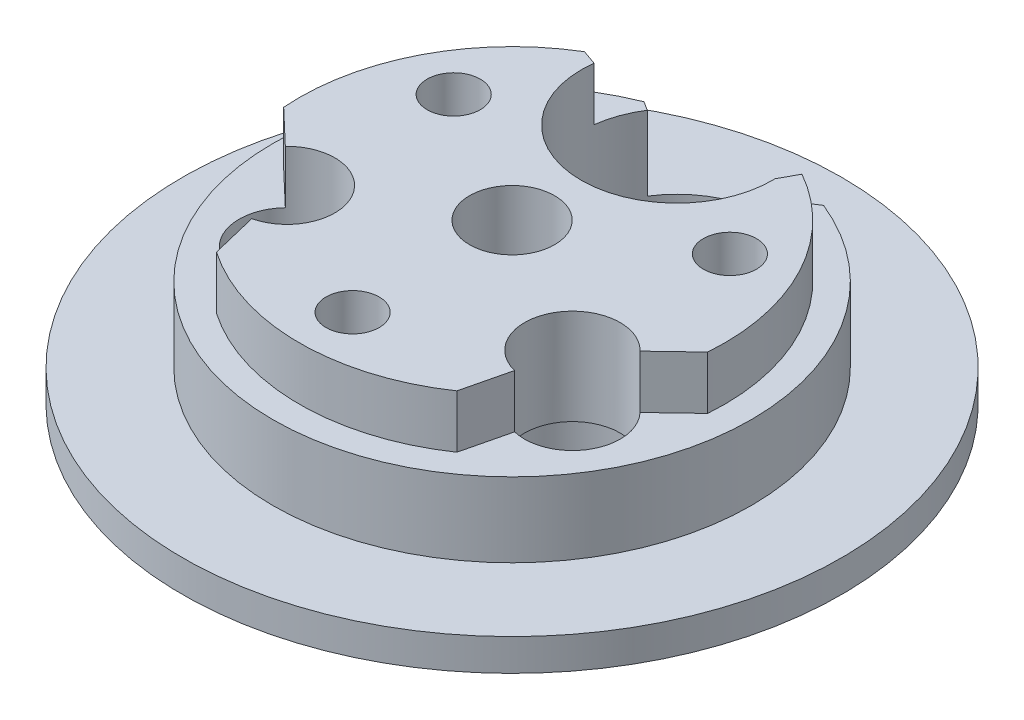
ISO-10303-21;
HEADER;
FILE_DESCRIPTION(('STEP AP214'),'2;1');
FILE_NAME('part.step','',(''),(''),'','','');
FILE_SCHEMA(('AUTOMOTIVE_DESIGN { 1 0 10303 214 1 1 1 1 }'));
ENDSEC;
DATA;
#1=APPLICATION_CONTEXT('core data for automotive mechanical design processes');
#2=APPLICATION_PROTOCOL_DEFINITION('international standard','automotive_design',2000,#1);
#3=PRODUCT_CONTEXT('',#1,'mechanical');
#4=PRODUCT('Part','Part','',(#3));
#5=PRODUCT_RELATED_PRODUCT_CATEGORY('part','',(#4));
#6=PRODUCT_DEFINITION_FORMATION('','',#4);
#7=PRODUCT_DEFINITION_CONTEXT('part definition',#1,'design');
#8=PRODUCT_DEFINITION('design','',#6,#7);
#9=PRODUCT_DEFINITION_SHAPE('','',#8);
#10=(LENGTH_UNIT() NAMED_UNIT(*) SI_UNIT(.MILLI.,.METRE.));
#11=(NAMED_UNIT(*) PLANE_ANGLE_UNIT() SI_UNIT($,.RADIAN.));
#12=(NAMED_UNIT(*) SI_UNIT($,.STERADIAN.) SOLID_ANGLE_UNIT());
#13=UNCERTAINTY_MEASURE_WITH_UNIT(LENGTH_MEASURE(1.E-05),#10,'distance_accuracy_value','');
#14=(GEOMETRIC_REPRESENTATION_CONTEXT(3) GLOBAL_UNCERTAINTY_ASSIGNED_CONTEXT((#13)) GLOBAL_UNIT_ASSIGNED_CONTEXT((#10,
#11,#12)) REPRESENTATION_CONTEXT('',''));
#15=CARTESIAN_POINT('',(0.,0.,0.));
#16=DIRECTION('',(0.,0.,1.));
#17=DIRECTION('',(1.,0.,0.));
#18=AXIS2_PLACEMENT_3D('',#15,#16,#17);
#19=CARTESIAN_POINT('',(13.4233937586587,0.,7.74999999999898));
#20=DIRECTION('',(0.,1.,0.));
#21=DIRECTION('',(0.,0.,1.));
#22=AXIS2_PLACEMENT_3D('',#19,#20,#21);
#23=CYLINDRICAL_SURFACE('',#22,4.5);
#24=CARTESIAN_POINT('',(13.4233937586596,7.,7.74999999999932));
#25=DIRECTION('',(0.,-1.,0.));
#26=DIRECTION('',(0.,0.,-1.));
#27=AXIS2_PLACEMENT_3D('',#24,#25,#26);
#28=CIRCLE('',#27,4.49999999999907);
#29=CARTESIAN_POINT('',(16.6818973601522,7.,4.64642878621094));
#30=VERTEX_POINT('',#29);
#31=CARTESIAN_POINT('',(12.3648740458117,7.,12.1237325041097));
#32=VERTEX_POINT('',#31);
#33=EDGE_CURVE('E210',#30,#32,#28,.T.);
#34=ORIENTED_EDGE('',*,*,#33,.F.);
#35=DIRECTION('',(0.,1.,0.));
#36=VECTOR('',#35,1.);
#37=CARTESIAN_POINT('',(16.6818973601522,0.,4.64642878621094));
#38=LINE('',#37,#36);
#39=CARTESIAN_POINT('',(16.6818973601522,12.,4.64642878621094));
#40=VERTEX_POINT('',#39);
#41=EDGE_CURVE('E254',#30,#40,#38,.T.);
#42=ORIENTED_EDGE('',*,*,#41,.T.);
#43=CARTESIAN_POINT('',(13.4233937586587,12.,7.74999999999898));
#44=DIRECTION('',(0.,1.,0.));
#45=DIRECTION('',(0.,0.,1.));
#46=AXIS2_PLACEMENT_3D('',#43,#44,#45);
#47=CIRCLE('',#46,4.5);
#48=CARTESIAN_POINT('',(12.3648740458117,12.,12.1237325041097));
#49=VERTEX_POINT('',#48);
#50=EDGE_CURVE('E250',#40,#49,#47,.T.);
#51=ORIENTED_EDGE('',*,*,#50,.T.);
#52=DIRECTION('',(0.,1.,0.));
#53=VECTOR('',#52,1.);
#54=CARTESIAN_POINT('',(12.3648740458117,0.,12.1237325041097));
#55=LINE('',#54,#53);
#56=EDGE_CURVE('E257',#32,#49,#55,.T.);
#57=ORIENTED_EDGE('',*,*,#56,.F.);
#58=EDGE_LOOP('',(#34,#42,#51,#57));
#59=FACE_BOUND('',#58,.T.);
#60=CARTESIAN_POINT('',(13.4233937586587,3.,7.74999999999898));
#61=DIRECTION('',(0.,-1.,0.));
#62=DIRECTION('',(0.,0.,-1.));
#63=AXIS2_PLACEMENT_3D('',#60,#61,#62);
#64=CIRCLE('',#63,4.5);
#65=CARTESIAN_POINT('',(13.4233937586587,3.,3.24999999999898));
#66=VERTEX_POINT('',#65);
#67=EDGE_CURVE('E194',#66,#66,#64,.T.);
#68=ORIENTED_EDGE('',*,*,#67,.T.);
#69=EDGE_LOOP('',(#68));
#70=FACE_BOUND('',#69,.T.);
#71=ADVANCED_FACE('F37',(#59,#70),#23,.F.);
#72=CARTESIAN_POINT('',(-13.4233937586578,0.,7.75000000000058));
#73=DIRECTION('',(0.,1.,0.));
#74=DIRECTION('',(0.,0.,1.));
#75=AXIS2_PLACEMENT_3D('',#72,#73,#74);
#76=CYLINDRICAL_SURFACE('',#75,4.5);
#77=CARTESIAN_POINT('',(-13.4233937586582,7.,7.75000000000077));
#78=DIRECTION('',(0.,-1.,0.));
#79=DIRECTION('',(0.,0.,-1.));
#80=AXIS2_PLACEMENT_3D('',#77,#78,#79);
#81=CIRCLE('',#80,4.49999999999986);
#82=CARTESIAN_POINT('',(-12.3648740458096,7.,12.123732504111));
#83=VERTEX_POINT('',#82);
#84=CARTESIAN_POINT('',(-16.6818973601514,7.,4.64642878621265));
#85=VERTEX_POINT('',#84);
#86=EDGE_CURVE('E217',#83,#85,#81,.T.);
#87=ORIENTED_EDGE('',*,*,#86,.F.);
#88=DIRECTION('',(0.,1.,0.));
#89=VECTOR('',#88,1.);
#90=CARTESIAN_POINT('',(-12.3648740458096,0.,12.123732504111));
#91=LINE('',#90,#89);
#92=CARTESIAN_POINT('',(-12.3648740458096,12.,12.123732504111));
#93=VERTEX_POINT('',#92);
#94=EDGE_CURVE('E263',#83,#93,#91,.T.);
#95=ORIENTED_EDGE('',*,*,#94,.T.);
#96=CARTESIAN_POINT('',(-13.4233937586578,12.,7.75000000000058));
#97=DIRECTION('',(0.,1.,0.));
#98=DIRECTION('',(0.,0.,1.));
#99=AXIS2_PLACEMENT_3D('',#96,#97,#98);
#100=CIRCLE('',#99,4.5);
#101=CARTESIAN_POINT('',(-16.6818973601514,12.,4.64642878621265));
#102=VERTEX_POINT('',#101);
#103=EDGE_CURVE('E238',#93,#102,#100,.T.);
#104=ORIENTED_EDGE('',*,*,#103,.T.);
#105=DIRECTION('',(0.,1.,0.));
#106=VECTOR('',#105,1.);
#107=CARTESIAN_POINT('',(-16.6818973601514,0.,4.64642878621265));
#108=LINE('',#107,#106);
#109=EDGE_CURVE('E265',#85,#102,#108,.T.);
#110=ORIENTED_EDGE('',*,*,#109,.F.);
#111=EDGE_LOOP('',(#87,#95,#104,#110));
#112=FACE_BOUND('',#111,.T.);
#113=CARTESIAN_POINT('',(-13.4233937586578,3.,7.75000000000058));
#114=DIRECTION('',(0.,-1.,0.));
#115=DIRECTION('',(0.,0.,-1.));
#116=AXIS2_PLACEMENT_3D('',#113,#114,#115);
#117=CIRCLE('',#116,4.5);
#118=CARTESIAN_POINT('',(-13.4233937586578,3.,3.25000000000058));
#119=VERTEX_POINT('',#118);
#120=EDGE_CURVE('E186',#119,#119,#117,.T.);
#121=ORIENTED_EDGE('',*,*,#120,.T.);
#122=EDGE_LOOP('',(#121));
#123=FACE_BOUND('',#122,.T.);
#124=ADVANCED_FACE('F347',(#112,#123),#76,.F.);
#125=CARTESIAN_POINT('',(10.2554041460994,0.,10.7673609022921));
#126=DIRECTION('',(0.689682491953068,0.,0.724111911442842));
#127=DIRECTION('',(0.724111911442842,0.,-0.689682491953068));
#128=AXIS2_PLACEMENT_3D('',#125,#126,#127);
#129=PLANE('',#128);
#130=ORIENTED_EDGE('',*,*,#41,.F.);
#131=DIRECTION('',(0.724111911442842,0.,-0.689682491953068));
#132=VECTOR('',#131,1.);
#133=CARTESIAN_POINT('',(10.2554041460994,7.,10.7673609022921));
#134=LINE('',#133,#132);
#135=CARTESIAN_POINT('',(19.940400961646,7.,1.54285757242123));
#136=VERTEX_POINT('',#135);
#137=EDGE_CURVE('E215',#30,#136,#134,.T.);
#138=ORIENTED_EDGE('',*,*,#137,.T.);
#139=DIRECTION('',(0.,1.,0.));
#140=VECTOR('',#139,1.);
#141=CARTESIAN_POINT('',(19.940400961646,0.,1.54285757242123));
#142=LINE('',#141,#140);
#143=CARTESIAN_POINT('',(19.940400961646,12.,1.54285757242123));
#144=VERTEX_POINT('',#143);
#145=EDGE_CURVE('E253',#136,#144,#142,.T.);
#146=ORIENTED_EDGE('',*,*,#145,.T.);
#147=DIRECTION('',(0.724111911442842,0.,-0.689682491953068));
#148=VECTOR('',#147,1.);
#149=CARTESIAN_POINT('',(10.2554041460994,12.,10.7673609022921));
#150=LINE('',#149,#148);
#151=EDGE_CURVE('E224',#40,#144,#150,.T.);
#152=ORIENTED_EDGE('',*,*,#151,.F.);
#153=EDGE_LOOP('',(#130,#138,#146,#152));
#154=FACE_BOUND('',#153,.T.);
#155=ADVANCED_FACE('F368',(#154),#129,.T.);
#156=CARTESIAN_POINT('',(14.4525101461505,0.,3.49776006544996));
#157=DIRECTION('',(0.97194055646898,0.,0.23522660285514));
#158=DIRECTION('',(0.23522660285514,0.,-0.97194055646898));
#159=AXIS2_PLACEMENT_3D('',#156,#157,#158);
#160=PLANE('',#159);
#161=DIRECTION('',(0.,1.,0.));
#162=VECTOR('',#161,1.);
#163=CARTESIAN_POINT('',(11.3063543329633,0.,16.4974650082211));
#164=LINE('',#163,#162);
#165=CARTESIAN_POINT('',(11.3063543329633,7.,16.4974650082211));
#166=VERTEX_POINT('',#165);
#167=CARTESIAN_POINT('',(11.3063543329633,12.,16.4974650082211));
#168=VERTEX_POINT('',#167);
#169=EDGE_CURVE('E259',#166,#168,#164,.T.);
#170=ORIENTED_EDGE('',*,*,#169,.F.);
#171=DIRECTION('',(0.23522660285514,0.,-0.97194055646898));
#172=VECTOR('',#171,1.);
#173=CARTESIAN_POINT('',(14.4525101461505,7.,3.49776006544996));
#174=LINE('',#173,#172);
#175=EDGE_CURVE('E213',#166,#32,#174,.T.);
#176=ORIENTED_EDGE('',*,*,#175,.T.);
#177=ORIENTED_EDGE('',*,*,#56,.T.);
#178=DIRECTION('',(0.23522660285514,0.,-0.97194055646898));
#179=VECTOR('',#178,1.);
#180=CARTESIAN_POINT('',(14.4525101461505,12.,3.49776006544996));
#181=LINE('',#180,#179);
#182=EDGE_CURVE('E247',#168,#49,#181,.T.);
#183=ORIENTED_EDGE('',*,*,#182,.F.);
#184=EDGE_LOOP('',(#170,#176,#177,#183));
#185=FACE_BOUND('',#184,.T.);
#186=ADVANCED_FACE('F334',(#185),#160,.T.);
#187=CARTESIAN_POINT('',(-14.4525101461489,0.,3.4977600654498));
#188=DIRECTION('',(-0.971940556468976,0.,0.235226602855154));
#189=DIRECTION('',(0.235226602855154,0.,0.971940556468977));
#190=AXIS2_PLACEMENT_3D('',#187,#188,#189);
#191=PLANE('',#190);
#192=ORIENTED_EDGE('',*,*,#94,.F.);
#193=DIRECTION('',(0.235226602855154,0.,0.971940556468977));
#194=VECTOR('',#193,1.);
#195=CARTESIAN_POINT('',(-14.4525101461489,7.,3.4977600654498));
#196=LINE('',#195,#194);
#197=CARTESIAN_POINT('',(-11.3063543329611,7.,16.4974650082226));
#198=VERTEX_POINT('',#197);
#199=EDGE_CURVE('E222',#83,#198,#196,.T.);
#200=ORIENTED_EDGE('',*,*,#199,.T.);
#201=DIRECTION('',(0.,1.,0.));
#202=VECTOR('',#201,1.);
#203=CARTESIAN_POINT('',(-11.3063543329611,0.,16.4974650082226));
#204=LINE('',#203,#202);
#205=CARTESIAN_POINT('',(-11.3063543329611,12.,16.4974650082226));
#206=VERTEX_POINT('',#205);
#207=EDGE_CURVE('E261',#198,#206,#204,.T.);
#208=ORIENTED_EDGE('',*,*,#207,.T.);
#209=DIRECTION('',(0.235226602855154,0.,0.971940556468977));
#210=VECTOR('',#209,1.);
#211=CARTESIAN_POINT('',(-14.4525101461489,12.,3.4977600654498));
#212=LINE('',#211,#210);
#213=EDGE_CURVE('E241',#93,#206,#212,.T.);
#214=ORIENTED_EDGE('',*,*,#213,.F.);
#215=EDGE_LOOP('',(#192,#200,#208,#214));
#216=FACE_BOUND('',#215,.T.);
#217=ADVANCED_FACE('F374',(#216),#191,.T.);
#218=CARTESIAN_POINT('',(-10.2554041460953,0.,10.7673609022937));
#219=DIRECTION('',(-0.689682491952872,0.,0.724111911443029));
#220=DIRECTION('',(0.724111911443029,0.,0.689682491952872));
#221=AXIS2_PLACEMENT_3D('',#218,#219,#220);
#222=PLANE('',#221);
#223=DIRECTION('',(0.,1.,0.));
#224=VECTOR('',#223,1.);
#225=CARTESIAN_POINT('',(-19.940400961646,0.,1.54285757242386));
#226=LINE('',#225,#224);
#227=CARTESIAN_POINT('',(-19.9404009616459,7.,1.54285757242382));
#228=VERTEX_POINT('',#227);
#229=CARTESIAN_POINT('',(-19.940400961646,12.,1.54285757242386));
#230=VERTEX_POINT('',#229);
#231=EDGE_CURVE('E267',#228,#230,#226,.T.);
#232=ORIENTED_EDGE('',*,*,#231,.F.);
#233=DIRECTION('',(0.724111911443029,0.,0.689682491952872));
#234=VECTOR('',#233,1.);
#235=CARTESIAN_POINT('',(-10.2554041460953,7.,10.7673609022937));
#236=LINE('',#235,#234);
#237=EDGE_CURVE('E220',#228,#85,#236,.T.);
#238=ORIENTED_EDGE('',*,*,#237,.T.);
#239=ORIENTED_EDGE('',*,*,#109,.T.);
#240=DIRECTION('',(0.724111911443029,0.,0.689682491952872));
#241=VECTOR('',#240,1.);
#242=CARTESIAN_POINT('',(-10.2554041460953,12.,10.7673609022937));
#243=LINE('',#242,#241);
#244=EDGE_CURVE('E235',#230,#102,#243,.T.);
#245=ORIENTED_EDGE('',*,*,#244,.F.);
#246=EDGE_LOOP('',(#232,#238,#239,#245));
#247=FACE_BOUND('',#246,.T.);
#248=ADVANCED_FACE('F352',(#247),#222,.T.);
#249=CARTESIAN_POINT('',(-7.0097272685014,7.,-11.0554838709677));
#250=DIRECTION('',(-0.535483870967742,0.,-0.844545454036314));
#251=DIRECTION('',(-0.844545454036314,0.,0.535483870967742));
#252=AXIS2_PLACEMENT_3D('',#249,#250,#251);
#253=PLANE('',#252);
#254=DIRECTION('',(0.844545454036314,0.,-0.535483870967742));
#255=VECTOR('',#254,1.);
#256=CARTESIAN_POINT('',(-7.0097272685014,0.,-11.0554838709677));
#257=LINE('',#256,#255);
#258=CARTESIAN_POINT('',(7.60090908632682,0.,-20.3193548387097));
#259=VERTEX_POINT('',#258);
#260=CARTESIAN_POINT('',(8.44545454036313,0.,-20.8548387096774));
#261=VERTEX_POINT('',#260);
#262=EDGE_CURVE('E171',#259,#261,#257,.T.);
#263=ORIENTED_EDGE('',*,*,#262,.F.);
#264=DIRECTION('',(0.,-1.,0.));
#265=VECTOR('',#264,1.);
#266=CARTESIAN_POINT('',(7.60090908632682,7.,-20.3193548387097));
#267=LINE('',#266,#265);
#268=CARTESIAN_POINT('',(7.60090908632682,7.,-20.3193548387097));
#269=VERTEX_POINT('',#268);
#270=EDGE_CURVE('E162',#269,#259,#267,.T.);
#271=ORIENTED_EDGE('',*,*,#270,.F.);
#272=DIRECTION('',(0.844545454036314,0.,-0.535483870967742));
#273=VECTOR('',#272,1.);
#274=CARTESIAN_POINT('',(-7.0097272685014,7.,-11.0554838709677));
#275=LINE('',#274,#273);
#276=CARTESIAN_POINT('',(8.44545454036313,7.,-20.8548387096774));
#277=VERTEX_POINT('',#276);
#278=EDGE_CURVE('E278',#269,#277,#275,.T.);
#279=ORIENTED_EDGE('',*,*,#278,.T.);
#280=DIRECTION('',(0.,-1.,0.));
#281=VECTOR('',#280,1.);
#282=CARTESIAN_POINT('',(8.44545454036313,7.,-20.8548387096774));
#283=LINE('',#282,#281);
#284=EDGE_CURVE('E289',#277,#261,#283,.T.);
#285=ORIENTED_EDGE('',*,*,#284,.T.);
#286=EDGE_LOOP('',(#263,#271,#279,#285));
#287=FACE_BOUND('',#286,.T.);
#288=ADVANCED_FACE('F378',(#287),#253,.T.);
#289=CARTESIAN_POINT('',(0.,7.,-15.5));
#290=DIRECTION('',(0.,-1.,0.));
#291=DIRECTION('',(0.,0.,-1.));
#292=AXIS2_PLACEMENT_3D('',#289,#290,#291);
#293=CYLINDRICAL_SURFACE('',#292,9.);
#294=CARTESIAN_POINT('',(0.,7.,-15.5));
#295=DIRECTION('',(0.,1.,0.));
#296=DIRECTION('',(0.,0.,1.));
#297=AXIS2_PLACEMENT_3D('',#294,#295,#296);
#298=CIRCLE('',#297,9.);
#299=CARTESIAN_POINT('',(-7.60090908632682,7.,-20.3193548387097));
#300=VERTEX_POINT('',#299);
#301=CARTESIAN_POINT('',(-8.92698905041271,7.,-16.6440570325869));
#302=VERTEX_POINT('',#301);
#303=EDGE_CURVE('E282',#300,#302,#298,.T.);
#304=ORIENTED_EDGE('',*,*,#303,.T.);
#305=DIRECTION('',(0.,-1.,0.));
#306=VECTOR('',#305,1.);
#307=CARTESIAN_POINT('',(-8.92698905041271,7.,-16.6440570325869));
#308=LINE('',#307,#306);
#309=CARTESIAN_POINT('',(-8.92698905041271,12.,-16.6440570325869));
#310=VERTEX_POINT('',#309);
#311=EDGE_CURVE('E295',#302,#310,#308,.F.);
#312=ORIENTED_EDGE('',*,*,#311,.T.);
#313=CARTESIAN_POINT('',(0.,12.,-15.5));
#314=DIRECTION('',(0.,1.,0.));
#315=DIRECTION('',(0.,0.,1.));
#316=AXIS2_PLACEMENT_3D('',#313,#314,#315);
#317=CIRCLE('',#316,9.);
#318=CARTESIAN_POINT('',(8.99649630282335,12.,-15.7511060996584));
#319=VERTEX_POINT('',#318);
#320=EDGE_CURVE('E230',#319,#310,#317,.F.);
#321=ORIENTED_EDGE('',*,*,#320,.F.);
#322=DIRECTION('',(0.,-1.,0.));
#323=VECTOR('',#322,1.);
#324=CARTESIAN_POINT('',(8.99649630282335,7.,-15.7511060996584));
#325=LINE('',#324,#323);
#326=CARTESIAN_POINT('',(8.99649630282335,7.,-15.7511060996584));
#327=VERTEX_POINT('',#326);
#328=EDGE_CURVE('E292',#319,#327,#325,.T.);
#329=ORIENTED_EDGE('',*,*,#328,.T.);
#330=EDGE_CURVE('E281',#327,#269,#298,.T.);
#331=ORIENTED_EDGE('',*,*,#330,.T.);
#332=ORIENTED_EDGE('',*,*,#270,.T.);
#333=CARTESIAN_POINT('',(0.,0.,-15.5));
#334=DIRECTION('',(0.,-1.,0.));
#335=DIRECTION('',(0.,0.,-1.));
#336=AXIS2_PLACEMENT_3D('',#333,#334,#335);
#337=CIRCLE('',#336,9.);
#338=CARTESIAN_POINT('',(-7.60090908632682,0.,-20.3193548387097));
#339=VERTEX_POINT('',#338);
#340=EDGE_CURVE('E169',#339,#259,#337,.T.);
#341=ORIENTED_EDGE('',*,*,#340,.F.);
#342=DIRECTION('',(0.,-1.,0.));
#343=VECTOR('',#342,1.);
#344=CARTESIAN_POINT('',(-7.60090908632682,7.,-20.3193548387097));
#345=LINE('',#344,#343);
#346=EDGE_CURVE('E151',#300,#339,#345,.T.);
#347=ORIENTED_EDGE('',*,*,#346,.F.);
#348=EDGE_LOOP('',(#304,#312,#321,#329,#331,#332,#341,#347));
#349=FACE_BOUND('',#348,.T.);
#350=CARTESIAN_POINT('',(0.,-3.,-15.5));
#351=DIRECTION('',(0.,-1.,0.));
#352=DIRECTION('',(0.,0.,-1.));
#353=AXIS2_PLACEMENT_3D('',#350,#351,#352);
#354=CIRCLE('',#353,9.);
#355=CARTESIAN_POINT('',(0.,-3.,-24.5));
#356=VERTEX_POINT('',#355);
#357=EDGE_CURVE('E180',#356,#356,#354,.T.);
#358=ORIENTED_EDGE('',*,*,#357,.T.);
#359=EDGE_LOOP('',(#358));
#360=FACE_BOUND('',#359,.T.);
#361=ADVANCED_FACE('F173',(#349,#360),#293,.F.);
#362=CARTESIAN_POINT('',(7.0097272685014,7.,-11.0554838709678));
#363=DIRECTION('',(0.535483870967742,0.,-0.844545454036314));
#364=DIRECTION('',(-0.844545454036314,0.,-0.535483870967742));
#365=AXIS2_PLACEMENT_3D('',#362,#363,#364);
#366=PLANE('',#365);
#367=DIRECTION('',(0.844545454036314,0.,0.535483870967742));
#368=VECTOR('',#367,1.);
#369=CARTESIAN_POINT('',(7.0097272685014,0.,-11.0554838709678));
#370=LINE('',#369,#368);
#371=CARTESIAN_POINT('',(-8.44545454036313,0.,-20.8548387096774));
#372=VERTEX_POINT('',#371);
#373=EDGE_CURVE('E155',#372,#339,#370,.T.);
#374=ORIENTED_EDGE('',*,*,#373,.F.);
#375=DIRECTION('',(0.,-1.,0.));
#376=VECTOR('',#375,1.);
#377=CARTESIAN_POINT('',(-8.44545454036313,7.,-20.8548387096774));
#378=LINE('',#377,#376);
#379=CARTESIAN_POINT('',(-8.44545454036313,7.,-20.8548387096774));
#380=VERTEX_POINT('',#379);
#381=EDGE_CURVE('E163',#380,#372,#378,.T.);
#382=ORIENTED_EDGE('',*,*,#381,.F.);
#383=DIRECTION('',(0.844545454036314,0.,0.535483870967742));
#384=VECTOR('',#383,1.);
#385=CARTESIAN_POINT('',(7.0097272685014,7.,-11.0554838709678));
#386=LINE('',#385,#384);
#387=EDGE_CURVE('E158',#380,#300,#386,.T.);
#388=ORIENTED_EDGE('',*,*,#387,.T.);
#389=ORIENTED_EDGE('',*,*,#346,.T.);
#390=EDGE_LOOP('',(#374,#382,#388,#389));
#391=FACE_BOUND('',#390,.T.);
#392=ADVANCED_FACE('F153',(#391),#366,.T.);
#393=CARTESIAN_POINT('',(0.,7.,0.));
#394=DIRECTION('',(0.,-1.,0.));
#395=DIRECTION('',(0.,0.,-1.));
#396=AXIS2_PLACEMENT_3D('',#393,#394,#395);
#397=CYLINDRICAL_SURFACE('',#396,22.5);
#398=CARTESIAN_POINT('',(0.,0.,0.));
#399=DIRECTION('',(0.,1.,0.));
#400=DIRECTION('',(0.,0.,1.));
#401=AXIS2_PLACEMENT_3D('',#398,#399,#400);
#402=CIRCLE('',#401,22.5);
#403=EDGE_CURVE('E170',#372,#261,#402,.T.);
#404=ORIENTED_EDGE('',*,*,#403,.T.);
#405=ORIENTED_EDGE('',*,*,#284,.F.);
#406=CARTESIAN_POINT('',(0.,7.,0.));
#407=DIRECTION('',(0.,1.,0.));
#408=DIRECTION('',(0.,0.,1.));
#409=AXIS2_PLACEMENT_3D('',#406,#407,#408);
#410=CIRCLE('',#409,22.5);
#411=EDGE_CURVE('E276',#380,#277,#410,.T.);
#412=ORIENTED_EDGE('',*,*,#411,.F.);
#413=ORIENTED_EDGE('',*,*,#381,.T.);
#414=EDGE_LOOP('',(#404,#405,#412,#413));
#415=FACE_BOUND('',#414,.T.);
#416=ADVANCED_FACE('F515',(#415),#397,.T.);
#417=CARTESIAN_POINT('',(0.,7.,0.));
#418=DIRECTION('',(0.,1.,0.));
#419=DIRECTION('',(0.,0.,1.));
#420=AXIS2_PLACEMENT_3D('',#417,#418,#419);
#421=PLANE('',#420);
#422=CARTESIAN_POINT('',(0.,7.,0.));
#423=DIRECTION('',(0.,1.,0.));
#424=DIRECTION('',(0.,0.,1.));
#425=AXIS2_PLACEMENT_3D('',#422,#423,#424);
#426=CIRCLE('',#425,19.9999999999997);
#427=CARTESIAN_POINT('',(9.88749588985201,7.,-17.3849769924538));
#428=VERTEX_POINT('',#427);
#429=EDGE_CURVE('E256',#136,#428,#426,.T.);
#430=ORIENTED_EDGE('',*,*,#429,.F.);
#431=ORIENTED_EDGE('',*,*,#137,.F.);
#432=ORIENTED_EDGE('',*,*,#33,.T.);
#433=ORIENTED_EDGE('',*,*,#175,.F.);
#434=CARTESIAN_POINT('',(0.,7.,0.));
#435=DIRECTION('',(0.,1.,0.));
#436=DIRECTION('',(0.,0.,1.));
#437=AXIS2_PLACEMENT_3D('',#434,#435,#436);
#438=CIRCLE('',#437,19.9999999999999);
#439=EDGE_CURVE('E274',#198,#166,#438,.T.);
#440=ORIENTED_EDGE('',*,*,#439,.F.);
#441=ORIENTED_EDGE('',*,*,#199,.F.);
#442=ORIENTED_EDGE('',*,*,#86,.T.);
#443=ORIENTED_EDGE('',*,*,#237,.F.);
#444=CARTESIAN_POINT('',(0.,7.,0.));
#445=DIRECTION('',(0.,1.,0.));
#446=DIRECTION('',(0.,0.,1.));
#447=AXIS2_PLACEMENT_3D('',#444,#445,#446);
#448=CIRCLE('',#447,19.9999999999999);
#449=CARTESIAN_POINT('',(-10.3163265488202,7.,-17.1339839657362));
#450=VERTEX_POINT('',#449);
#451=EDGE_CURVE('E272',#450,#228,#448,.T.);
#452=ORIENTED_EDGE('',*,*,#451,.F.);
#453=DIRECTION('',(0.943081367589559,0.,0.332562075566964));
#454=VECTOR('',#453,1.);
#455=CARTESIAN_POINT('',(-8.92698905041271,7.,-16.6440570325869));
#456=LINE('',#455,#454);
#457=EDGE_CURVE('E46',#450,#302,#456,.T.);
#458=ORIENTED_EDGE('',*,*,#457,.T.);
#459=ORIENTED_EDGE('',*,*,#303,.F.);
#460=ORIENTED_EDGE('',*,*,#387,.F.);
#461=ORIENTED_EDGE('',*,*,#411,.T.);
#462=ORIENTED_EDGE('',*,*,#278,.F.);
#463=ORIENTED_EDGE('',*,*,#330,.F.);
#464=DIRECTION('',(0.478768177449677,0.,-0.877941360377511));
#465=VECTOR('',#464,1.);
#466=CARTESIAN_POINT('',(9.88749588985201,7.,-17.3849769924538));
#467=LINE('',#466,#465);
#468=EDGE_CURVE('E11',#327,#428,#467,.T.);
#469=ORIENTED_EDGE('',*,*,#468,.T.);
#470=EDGE_LOOP('',(#430,#431,#432,#433,#440,#441,#442,#443,#452,#458,#459,#460,#461,#462,#463,#469));
#471=FACE_BOUND('',#470,.T.);
#472=ADVANCED_FACE('F308',(#471),#421,.T.);
#473=CARTESIAN_POINT('',(0.,0.,0.));
#474=DIRECTION('',(0.,1.,0.));
#475=DIRECTION('',(0.,0.,1.));
#476=AXIS2_PLACEMENT_3D('',#473,#474,#475);
#477=CYLINDRICAL_SURFACE('',#476,19.9999999999999);
#478=ORIENTED_EDGE('',*,*,#207,.F.);
#479=ORIENTED_EDGE('',*,*,#439,.T.);
#480=ORIENTED_EDGE('',*,*,#169,.T.);
#481=CARTESIAN_POINT('',(0.,12.,0.));
#482=DIRECTION('',(0.,1.,0.));
#483=DIRECTION('',(0.,0.,1.));
#484=AXIS2_PLACEMENT_3D('',#481,#482,#483);
#485=CIRCLE('',#484,19.9999999999999);
#486=EDGE_CURVE('E244',#206,#168,#485,.T.);
#487=ORIENTED_EDGE('',*,*,#486,.F.);
#488=EDGE_LOOP('',(#478,#479,#480,#487));
#489=FACE_BOUND('',#488,.T.);
#490=ADVANCED_FACE('F340',(#489),#477,.T.);
#491=CARTESIAN_POINT('',(0.,0.,0.));
#492=DIRECTION('',(0.,1.,0.));
#493=DIRECTION('',(0.,0.,1.));
#494=AXIS2_PLACEMENT_3D('',#491,#492,#493);
#495=CYLINDRICAL_SURFACE('',#494,19.9999999999999);
#496=CARTESIAN_POINT('',(0.,12.,0.));
#497=DIRECTION('',(0.,1.,0.));
#498=DIRECTION('',(0.,0.,1.));
#499=AXIS2_PLACEMENT_3D('',#496,#497,#498);
#500=CIRCLE('',#499,19.9999999999999);
#501=CARTESIAN_POINT('',(-10.3163265488202,12.,-17.1339839657362));
#502=VERTEX_POINT('',#501);
#503=EDGE_CURVE('E233',#502,#230,#500,.T.);
#504=ORIENTED_EDGE('',*,*,#503,.F.);
#505=DIRECTION('',(0.,1.,0.));
#506=VECTOR('',#505,1.);
#507=CARTESIAN_POINT('',(-10.3163265488202,0.,-17.1339839657362));
#508=LINE('',#507,#506);
#509=EDGE_CURVE('E59',#502,#450,#508,.F.);
#510=ORIENTED_EDGE('',*,*,#509,.T.);
#511=ORIENTED_EDGE('',*,*,#451,.T.);
#512=ORIENTED_EDGE('',*,*,#231,.T.);
#513=EDGE_LOOP('',(#504,#510,#511,#512));
#514=FACE_BOUND('',#513,.T.);
#515=ADVANCED_FACE('F353',(#514),#495,.T.);
#516=CARTESIAN_POINT('',(0.,0.,0.));
#517=DIRECTION('',(0.,1.,0.));
#518=DIRECTION('',(0.,0.,1.));
#519=AXIS2_PLACEMENT_3D('',#516,#517,#518);
#520=CYLINDRICAL_SURFACE('',#519,19.9999999999997);
#521=ORIENTED_EDGE('',*,*,#429,.T.);
#522=DIRECTION('',(0.,1.,0.));
#523=VECTOR('',#522,1.);
#524=CARTESIAN_POINT('',(9.88749588985201,0.,-17.3849769924538));
#525=LINE('',#524,#523);
#526=CARTESIAN_POINT('',(9.88749588985201,12.,-17.3849769924538));
#527=VERTEX_POINT('',#526);
#528=EDGE_CURVE('E303',#428,#527,#525,.T.);
#529=ORIENTED_EDGE('',*,*,#528,.T.);
#530=CARTESIAN_POINT('',(0.,12.,0.));
#531=DIRECTION('',(0.,1.,0.));
#532=DIRECTION('',(0.,0.,1.));
#533=AXIS2_PLACEMENT_3D('',#530,#531,#532);
#534=CIRCLE('',#533,19.9999999999997);
#535=EDGE_CURVE('E227',#144,#527,#534,.T.);
#536=ORIENTED_EDGE('',*,*,#535,.F.);
#537=ORIENTED_EDGE('',*,*,#145,.F.);
#538=EDGE_LOOP('',(#521,#529,#536,#537));
#539=FACE_BOUND('',#538,.T.);
#540=ADVANCED_FACE('F320',(#539),#520,.T.);
#541=CARTESIAN_POINT('',(0.,12.,0.));
#542=DIRECTION('',(0.,1.,0.));
#543=DIRECTION('',(0.,0.,1.));
#544=AXIS2_PLACEMENT_3D('',#541,#542,#543);
#545=PLANE('',#544);
#546=CARTESIAN_POINT('',(9.73185298338807E-13,12.,14.9999999999994));
#547=DIRECTION('',(0.,1.,0.));
#548=DIRECTION('',(0.,0.,1.));
#549=AXIS2_PLACEMENT_3D('',#546,#547,#548);
#550=CIRCLE('',#549,2.5);
#551=CARTESIAN_POINT('',(9.73185298338807E-13,12.,17.4999999999994));
#552=VERTEX_POINT('',#551);
#553=EDGE_CURVE('E193',#552,#552,#550,.T.);
#554=ORIENTED_EDGE('',*,*,#553,.F.);
#555=EDGE_LOOP('',(#554));
#556=FACE_BOUND('',#555,.T.);
#557=CARTESIAN_POINT('',(12.9903810567666,12.,-7.50000000000112));
#558=DIRECTION('',(0.,1.,0.));
#559=DIRECTION('',(0.,0.,1.));
#560=AXIS2_PLACEMENT_3D('',#557,#558,#559);
#561=CIRCLE('',#560,2.5);
#562=CARTESIAN_POINT('',(12.9903810567666,12.,-5.00000000000112));
#563=VERTEX_POINT('',#562);
#564=EDGE_CURVE('E203',#563,#563,#561,.T.);
#565=ORIENTED_EDGE('',*,*,#564,.F.);
#566=EDGE_LOOP('',(#565));
#567=FACE_BOUND('',#566,.T.);
#568=CARTESIAN_POINT('',(-12.9903810567666,12.,-7.5));
#569=DIRECTION('',(0.,1.,0.));
#570=DIRECTION('',(0.,0.,1.));
#571=AXIS2_PLACEMENT_3D('',#568,#569,#570);
#572=CIRCLE('',#571,2.5);
#573=CARTESIAN_POINT('',(-12.9903810567666,12.,-5.));
#574=VERTEX_POINT('',#573);
#575=EDGE_CURVE('E199',#574,#574,#572,.T.);
#576=ORIENTED_EDGE('',*,*,#575,.F.);
#577=EDGE_LOOP('',(#576));
#578=FACE_BOUND('',#577,.T.);
#579=CARTESIAN_POINT('',(0.,12.,0.));
#580=DIRECTION('',(0.,1.,0.));
#581=DIRECTION('',(0.,0.,1.));
#582=AXIS2_PLACEMENT_3D('',#579,#580,#581);
#583=CIRCLE('',#582,4.);
#584=CARTESIAN_POINT('',(0.,12.,4.));
#585=VERTEX_POINT('',#584);
#586=EDGE_CURVE('E202',#585,#585,#583,.T.);
#587=ORIENTED_EDGE('',*,*,#586,.F.);
#588=EDGE_LOOP('',(#587));
#589=FACE_BOUND('',#588,.T.);
#590=ORIENTED_EDGE('',*,*,#320,.T.);
#591=DIRECTION('',(-0.943081367589559,0.,-0.332562075566964));
#592=VECTOR('',#591,1.);
#593=CARTESIAN_POINT('',(4.23282417838104,12.,-12.0034661442024));
#594=LINE('',#593,#592);
#595=EDGE_CURVE('E300',#310,#502,#594,.T.);
#596=ORIENTED_EDGE('',*,*,#595,.T.);
#597=ORIENTED_EDGE('',*,*,#503,.T.);
#598=ORIENTED_EDGE('',*,*,#244,.T.);
#599=ORIENTED_EDGE('',*,*,#103,.F.);
#600=ORIENTED_EDGE('',*,*,#213,.T.);
#601=ORIENTED_EDGE('',*,*,#486,.T.);
#602=ORIENTED_EDGE('',*,*,#182,.T.);
#603=ORIENTED_EDGE('',*,*,#50,.F.);
#604=ORIENTED_EDGE('',*,*,#151,.T.);
#605=ORIENTED_EDGE('',*,*,#535,.T.);
#606=DIRECTION('',(-0.478768177449677,0.,0.877941360377511));
#607=VECTOR('',#606,1.);
#608=CARTESIAN_POINT('',(0.313660215735609,12.,0.171048473854378));
#609=LINE('',#608,#607);
#610=EDGE_CURVE('E298',#527,#319,#609,.T.);
#611=ORIENTED_EDGE('',*,*,#610,.T.);
#612=EDGE_LOOP('',(#590,#596,#597,#598,#599,#600,#601,#602,#603,#604,#605,#611));
#613=FACE_BOUND('',#612,.T.);
#614=ADVANCED_FACE('F315',(#556,#567,#578,#589,#613),#545,.T.);
#615=CARTESIAN_POINT('',(0.,0.,0.));
#616=DIRECTION('',(0.,1.,0.));
#617=DIRECTION('',(0.,0.,1.));
#618=AXIS2_PLACEMENT_3D('',#615,#616,#617);
#619=CYLINDRICAL_SURFACE('',#618,4.);
#620=ORIENTED_EDGE('',*,*,#586,.T.);
#621=EDGE_LOOP('',(#620));
#622=FACE_BOUND('',#621,.T.);
#623=CARTESIAN_POINT('',(0.,-3.,0.));
#624=DIRECTION('',(0.,-1.,0.));
#625=DIRECTION('',(0.,0.,-1.));
#626=AXIS2_PLACEMENT_3D('',#623,#624,#625);
#627=CIRCLE('',#626,4.);
#628=CARTESIAN_POINT('',(0.,-3.,-4.));
#629=VERTEX_POINT('',#628);
#630=EDGE_CURVE('E450',#629,#629,#627,.F.);
#631=ORIENTED_EDGE('',*,*,#630,.F.);
#632=EDGE_LOOP('',(#631));
#633=FACE_BOUND('',#632,.T.);
#634=ADVANCED_FACE('F433',(#622,#633),#619,.F.);
#635=CARTESIAN_POINT('',(-12.9903810567666,0.,-7.5));
#636=DIRECTION('',(0.,1.,0.));
#637=DIRECTION('',(0.,0.,1.));
#638=AXIS2_PLACEMENT_3D('',#635,#636,#637);
#639=CYLINDRICAL_SURFACE('',#638,2.5);
#640=ORIENTED_EDGE('',*,*,#575,.T.);
#641=EDGE_LOOP('',(#640));
#642=FACE_BOUND('',#641,.T.);
#643=CARTESIAN_POINT('',(-12.9903810567666,-3.,-7.5));
#644=DIRECTION('',(0.,-1.,0.));
#645=DIRECTION('',(0.,0.,-1.));
#646=AXIS2_PLACEMENT_3D('',#643,#644,#645);
#647=CIRCLE('',#646,2.5);
#648=CARTESIAN_POINT('',(-12.9903810567666,-3.,-9.99999999999999));
#649=VERTEX_POINT('',#648);
#650=EDGE_CURVE('E452',#649,#649,#647,.F.);
#651=ORIENTED_EDGE('',*,*,#650,.F.);
#652=EDGE_LOOP('',(#651));
#653=FACE_BOUND('',#652,.T.);
#654=ADVANCED_FACE('F429',(#642,#653),#639,.F.);
#655=CARTESIAN_POINT('',(12.9903810567666,0.,-7.50000000000112));
#656=DIRECTION('',(0.,1.,0.));
#657=DIRECTION('',(0.,0.,1.));
#658=AXIS2_PLACEMENT_3D('',#655,#656,#657);
#659=CYLINDRICAL_SURFACE('',#658,2.5);
#660=ORIENTED_EDGE('',*,*,#564,.T.);
#661=EDGE_LOOP('',(#660));
#662=FACE_BOUND('',#661,.T.);
#663=CARTESIAN_POINT('',(12.9903810567666,-3.,-7.50000000000112));
#664=DIRECTION('',(0.,-1.,0.));
#665=DIRECTION('',(0.,0.,-1.));
#666=AXIS2_PLACEMENT_3D('',#663,#664,#665);
#667=CIRCLE('',#666,2.5);
#668=CARTESIAN_POINT('',(12.9903810567666,-3.,-10.0000000000011));
#669=VERTEX_POINT('',#668);
#670=EDGE_CURVE('E453',#669,#669,#667,.F.);
#671=ORIENTED_EDGE('',*,*,#670,.F.);
#672=EDGE_LOOP('',(#671));
#673=FACE_BOUND('',#672,.T.);
#674=ADVANCED_FACE('F432',(#662,#673),#659,.F.);
#675=CARTESIAN_POINT('',(9.73185298338807E-13,0.,14.9999999999994));
#676=DIRECTION('',(0.,1.,0.));
#677=DIRECTION('',(0.,0.,1.));
#678=AXIS2_PLACEMENT_3D('',#675,#676,#677);
#679=CYLINDRICAL_SURFACE('',#678,2.5);
#680=ORIENTED_EDGE('',*,*,#553,.T.);
#681=EDGE_LOOP('',(#680));
#682=FACE_BOUND('',#681,.T.);
#683=CARTESIAN_POINT('',(9.73185298338807E-13,-3.,14.9999999999994));
#684=DIRECTION('',(0.,-1.,0.));
#685=DIRECTION('',(0.,0.,-1.));
#686=AXIS2_PLACEMENT_3D('',#683,#684,#685);
#687=CIRCLE('',#686,2.5);
#688=CARTESIAN_POINT('',(9.73185298338807E-13,-3.,12.4999999999994));
#689=VERTEX_POINT('',#688);
#690=EDGE_CURVE('E456',#689,#689,#687,.F.);
#691=ORIENTED_EDGE('',*,*,#690,.F.);
#692=EDGE_LOOP('',(#691));
#693=FACE_BOUND('',#692,.T.);
#694=ADVANCED_FACE('F421',(#682,#693),#679,.F.);
#695=CARTESIAN_POINT('',(-13.4233937586578,3.,7.75000000000058));
#696=DIRECTION('',(0.,-1.,0.));
#697=DIRECTION('',(0.,0.,-1.));
#698=AXIS2_PLACEMENT_3D('',#695,#696,#697);
#699=CYLINDRICAL_SURFACE('',#698,6.);
#700=CARTESIAN_POINT('',(-13.4233937586578,3.,7.75000000000058));
#701=DIRECTION('',(0.,-1.,0.));
#702=DIRECTION('',(0.,0.,-1.));
#703=AXIS2_PLACEMENT_3D('',#700,#701,#702);
#704=CIRCLE('',#703,6.);
#705=CARTESIAN_POINT('',(-13.4233937586578,3.,1.75000000000058));
#706=VERTEX_POINT('',#705);
#707=EDGE_CURVE('E189',#706,#706,#704,.T.);
#708=ORIENTED_EDGE('',*,*,#707,.F.);
#709=EDGE_LOOP('',(#708));
#710=FACE_BOUND('',#709,.T.);
#711=CARTESIAN_POINT('',(-13.4233937586578,-3.,7.75000000000058));
#712=DIRECTION('',(0.,-1.,0.));
#713=DIRECTION('',(0.,0.,-1.));
#714=AXIS2_PLACEMENT_3D('',#711,#712,#713);
#715=CIRCLE('',#714,6.);
#716=CARTESIAN_POINT('',(-13.4233937586578,-3.,1.75000000000058));
#717=VERTEX_POINT('',#716);
#718=EDGE_CURVE('E183',#717,#717,#715,.F.);
#719=ORIENTED_EDGE('',*,*,#718,.F.);
#720=EDGE_LOOP('',(#719));
#721=FACE_BOUND('',#720,.T.);
#722=ADVANCED_FACE('F417',(#710,#721),#699,.F.);
#723=CARTESIAN_POINT('',(-13.4233937586578,3.,7.75000000000058));
#724=DIRECTION('',(0.,-1.,0.));
#725=DIRECTION('',(0.,0.,-1.));
#726=AXIS2_PLACEMENT_3D('',#723,#724,#725);
#727=PLANE('',#726);
#728=ORIENTED_EDGE('',*,*,#120,.F.);
#729=EDGE_LOOP('',(#728));
#730=FACE_BOUND('',#729,.T.);
#731=ORIENTED_EDGE('',*,*,#707,.T.);
#732=EDGE_LOOP('',(#731));
#733=FACE_BOUND('',#732,.T.);
#734=ADVANCED_FACE('F413',(#730,#733),#727,.T.);
#735=CARTESIAN_POINT('',(13.4233937586587,3.,7.74999999999898));
#736=DIRECTION('',(0.,-1.,0.));
#737=DIRECTION('',(0.,0.,-1.));
#738=AXIS2_PLACEMENT_3D('',#735,#736,#737);
#739=CYLINDRICAL_SURFACE('',#738,6.);
#740=CARTESIAN_POINT('',(13.4233937586587,3.,7.74999999999898));
#741=DIRECTION('',(0.,-1.,0.));
#742=DIRECTION('',(0.,0.,-1.));
#743=AXIS2_PLACEMENT_3D('',#740,#741,#742);
#744=CIRCLE('',#743,6.);
#745=CARTESIAN_POINT('',(13.4233937586587,3.,1.74999999999898));
#746=VERTEX_POINT('',#745);
#747=EDGE_CURVE('E190',#746,#746,#744,.T.);
#748=ORIENTED_EDGE('',*,*,#747,.F.);
#749=EDGE_LOOP('',(#748));
#750=FACE_BOUND('',#749,.T.);
#751=CARTESIAN_POINT('',(13.4233937586587,-3.,7.74999999999898));
#752=DIRECTION('',(0.,-1.,0.));
#753=DIRECTION('',(0.,0.,-1.));
#754=AXIS2_PLACEMENT_3D('',#751,#752,#753);
#755=CIRCLE('',#754,6.);
#756=CARTESIAN_POINT('',(13.4233937586587,-3.,1.74999999999898));
#757=VERTEX_POINT('',#756);
#758=EDGE_CURVE('E459',#757,#757,#755,.F.);
#759=ORIENTED_EDGE('',*,*,#758,.F.);
#760=EDGE_LOOP('',(#759));
#761=FACE_BOUND('',#760,.T.);
#762=ADVANCED_FACE('F416',(#750,#761),#739,.F.);
#763=CARTESIAN_POINT('',(13.4233937586587,3.,7.74999999999898));
#764=DIRECTION('',(0.,-1.,0.));
#765=DIRECTION('',(0.,0.,-1.));
#766=AXIS2_PLACEMENT_3D('',#763,#764,#765);
#767=PLANE('',#766);
#768=ORIENTED_EDGE('',*,*,#67,.F.);
#769=EDGE_LOOP('',(#768));
#770=FACE_BOUND('',#769,.T.);
#771=ORIENTED_EDGE('',*,*,#747,.T.);
#772=EDGE_LOOP('',(#771));
#773=FACE_BOUND('',#772,.T.);
#774=ADVANCED_FACE('F410',(#770,#773),#767,.T.);
#775=CARTESIAN_POINT('',(0.,0.,0.));
#776=DIRECTION('',(0.,-1.,0.));
#777=DIRECTION('',(0.,0.,-1.));
#778=AXIS2_PLACEMENT_3D('',#775,#776,#777);
#779=PLANE('',#778);
#780=CARTESIAN_POINT('',(0.,0.,0.));
#781=DIRECTION('',(0.,-1.,0.));
#782=DIRECTION('',(0.,0.,-1.));
#783=AXIS2_PLACEMENT_3D('',#780,#781,#782);
#784=CIRCLE('',#783,31.);
#785=CARTESIAN_POINT('',(0.,0.,-31.));
#786=VERTEX_POINT('',#785);
#787=EDGE_CURVE('E177',#786,#786,#784,.T.);
#788=ORIENTED_EDGE('',*,*,#787,.F.);
#789=EDGE_LOOP('',(#788));
#790=FACE_BOUND('',#789,.T.);
#791=ORIENTED_EDGE('',*,*,#340,.T.);
#792=ORIENTED_EDGE('',*,*,#262,.T.);
#793=ORIENTED_EDGE('',*,*,#403,.F.);
#794=ORIENTED_EDGE('',*,*,#373,.T.);
#795=EDGE_LOOP('',(#791,#792,#793,#794));
#796=FACE_BOUND('',#795,.T.);
#797=ADVANCED_FACE('F167',(#790,#796),#779,.F.);
#798=CARTESIAN_POINT('',(0.,-3.,0.));
#799=DIRECTION('',(0.,1.,0.));
#800=DIRECTION('',(0.,0.,1.));
#801=AXIS2_PLACEMENT_3D('',#798,#799,#800);
#802=CYLINDRICAL_SURFACE('',#801,31.);
#803=CARTESIAN_POINT('',(0.,-3.,0.));
#804=DIRECTION('',(0.,-1.,0.));
#805=DIRECTION('',(0.,0.,-1.));
#806=AXIS2_PLACEMENT_3D('',#803,#804,#805);
#807=CIRCLE('',#806,31.);
#808=CARTESIAN_POINT('',(0.,-3.,-31.));
#809=VERTEX_POINT('',#808);
#810=EDGE_CURVE('E472',#809,#809,#807,.T.);
#811=ORIENTED_EDGE('',*,*,#810,.F.);
#812=EDGE_LOOP('',(#811));
#813=FACE_BOUND('',#812,.T.);
#814=ORIENTED_EDGE('',*,*,#787,.T.);
#815=EDGE_LOOP('',(#814));
#816=FACE_BOUND('',#815,.T.);
#817=ADVANCED_FACE('F398',(#813,#816),#802,.T.);
#818=CARTESIAN_POINT('',(0.,-3.,0.));
#819=DIRECTION('',(0.,-1.,0.));
#820=DIRECTION('',(0.,0.,-1.));
#821=AXIS2_PLACEMENT_3D('',#818,#819,#820);
#822=PLANE('',#821);
#823=ORIENTED_EDGE('',*,*,#357,.F.);
#824=EDGE_LOOP('',(#823));
#825=FACE_BOUND('',#824,.T.);
#826=ORIENTED_EDGE('',*,*,#810,.T.);
#827=EDGE_LOOP('',(#826));
#828=FACE_BOUND('',#827,.T.);
#829=ORIENTED_EDGE('',*,*,#758,.T.);
#830=EDGE_LOOP('',(#829));
#831=FACE_BOUND('',#830,.T.);
#832=ORIENTED_EDGE('',*,*,#670,.T.);
#833=EDGE_LOOP('',(#832));
#834=FACE_BOUND('',#833,.T.);
#835=ORIENTED_EDGE('',*,*,#630,.T.);
#836=EDGE_LOOP('',(#835));
#837=FACE_BOUND('',#836,.T.);
#838=ORIENTED_EDGE('',*,*,#650,.T.);
#839=EDGE_LOOP('',(#838));
#840=FACE_BOUND('',#839,.T.);
#841=ORIENTED_EDGE('',*,*,#690,.T.);
#842=EDGE_LOOP('',(#841));
#843=FACE_BOUND('',#842,.T.);
#844=ORIENTED_EDGE('',*,*,#718,.T.);
#845=EDGE_LOOP('',(#844));
#846=FACE_BOUND('',#845,.T.);
#847=ADVANCED_FACE('F393',(#825,#828,#831,#834,#837,#840,#843,#846),#822,.T.);
#848=CARTESIAN_POINT('',(-8.92698905041271,0.,-16.6440570325869));
#849=DIRECTION('',(0.332562075566964,0.,-0.943081367589559));
#850=DIRECTION('',(0.,-1.,0.));
#851=AXIS2_PLACEMENT_3D('',#848,#849,#850);
#852=PLANE('',#851);
#853=ORIENTED_EDGE('',*,*,#457,.F.);
#854=ORIENTED_EDGE('',*,*,#509,.F.);
#855=ORIENTED_EDGE('',*,*,#595,.F.);
#856=ORIENTED_EDGE('',*,*,#311,.F.);
#857=EDGE_LOOP('',(#853,#854,#855,#856));
#858=FACE_BOUND('',#857,.T.);
#859=ADVANCED_FACE('F311',(#858),#852,.T.);
#860=CARTESIAN_POINT('',(9.88749588985201,7.,-17.3849769924538));
#861=DIRECTION('',(-0.877941360377511,0.,-0.478768177449677));
#862=DIRECTION('',(0.,-1.,0.));
#863=AXIS2_PLACEMENT_3D('',#860,#861,#862);
#864=PLANE('',#863);
#865=ORIENTED_EDGE('',*,*,#468,.F.);
#866=ORIENTED_EDGE('',*,*,#328,.F.);
#867=ORIENTED_EDGE('',*,*,#610,.F.);
#868=ORIENTED_EDGE('',*,*,#528,.F.);
#869=EDGE_LOOP('',(#865,#866,#867,#868));
#870=FACE_BOUND('',#869,.T.);
#871=ADVANCED_FACE('F40',(#870),#864,.T.);
#872=CLOSED_SHELL('',(#71,#124,#155,#186,#217,#248,#288,#361,#392,#416,#472,#490,#515,#540,#614,
#634,#654,#674,#694,#722,#734,#762,#774,#797,#817,#847,#859,#871));
#873=MANIFOLD_SOLID_BREP('B2',#872);
#874=ADVANCED_BREP_SHAPE_REPRESENTATION('',(#18,#873),#14);
#875=SHAPE_DEFINITION_REPRESENTATION(#9,#874);
ENDSEC;
END-ISO-10303-21;
